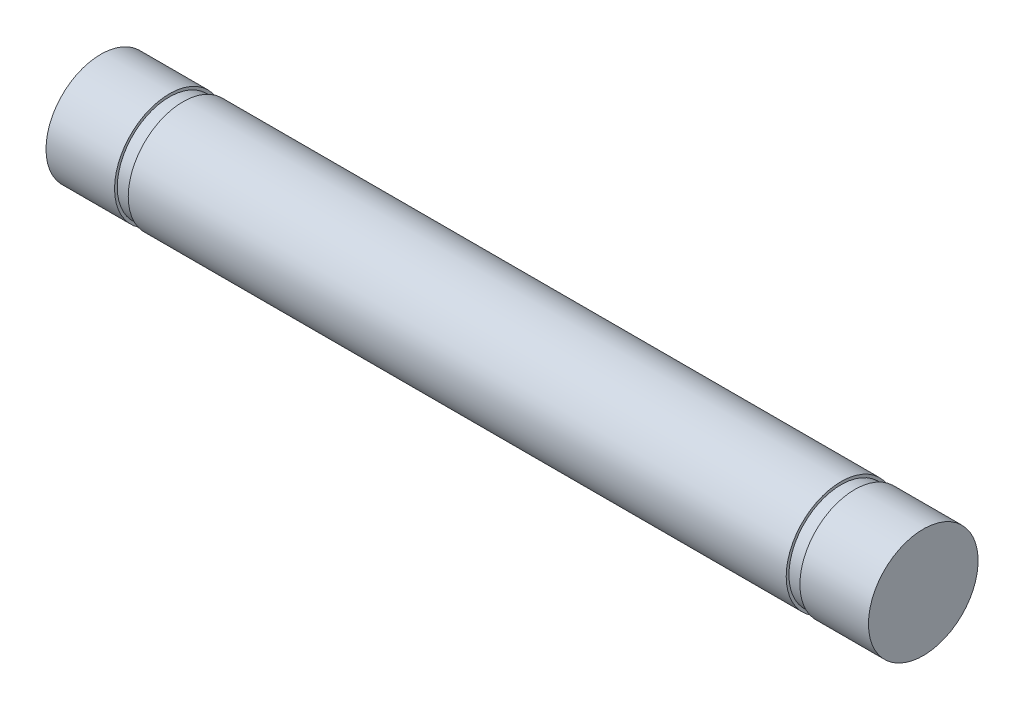
ISO-10303-21;
HEADER;
FILE_DESCRIPTION(('STEP AP214'),'2;1');
FILE_NAME('part.step','',(''),(''),'','','');
FILE_SCHEMA(('AUTOMOTIVE_DESIGN { 1 0 10303 214 1 1 1 1 }'));
ENDSEC;
DATA;
#1=APPLICATION_CONTEXT('core data for automotive mechanical design processes');
#2=APPLICATION_PROTOCOL_DEFINITION('international standard','automotive_design',2000,#1);
#3=PRODUCT_CONTEXT('',#1,'mechanical');
#4=PRODUCT('Part','Part','',(#3));
#5=PRODUCT_RELATED_PRODUCT_CATEGORY('part','',(#4));
#6=PRODUCT_DEFINITION_FORMATION('','',#4);
#7=PRODUCT_DEFINITION_CONTEXT('part definition',#1,'design');
#8=PRODUCT_DEFINITION('design','',#6,#7);
#9=PRODUCT_DEFINITION_SHAPE('','',#8);
#10=(LENGTH_UNIT() NAMED_UNIT(*) SI_UNIT(.MILLI.,.METRE.));
#11=(NAMED_UNIT(*) PLANE_ANGLE_UNIT() SI_UNIT($,.RADIAN.));
#12=(NAMED_UNIT(*) SI_UNIT($,.STERADIAN.) SOLID_ANGLE_UNIT());
#13=UNCERTAINTY_MEASURE_WITH_UNIT(LENGTH_MEASURE(1.E-05),#10,'distance_accuracy_value','');
#14=(GEOMETRIC_REPRESENTATION_CONTEXT(3) GLOBAL_UNCERTAINTY_ASSIGNED_CONTEXT((#13)) GLOBAL_UNIT_ASSIGNED_CONTEXT((#10,
#11,#12)) REPRESENTATION_CONTEXT('',''));
#15=CARTESIAN_POINT('',(0.,0.,0.));
#16=DIRECTION('',(0.,0.,1.));
#17=DIRECTION('',(1.,0.,0.));
#18=AXIS2_PLACEMENT_3D('',#15,#16,#17);
#19=CARTESIAN_POINT('',(0.,0.,0.));
#20=DIRECTION('',(1.,0.,0.));
#21=DIRECTION('',(0.,0.,-1.));
#22=AXIS2_PLACEMENT_3D('',#19,#20,#21);
#23=PLANE('',#22);
#24=CARTESIAN_POINT('',(0.,0.,0.));
#25=DIRECTION('',(-1.,0.,0.));
#26=DIRECTION('',(0.,0.,1.));
#27=AXIS2_PLACEMENT_3D('',#24,#25,#26);
#28=CIRCLE('',#27,2.);
#29=CARTESIAN_POINT('',(0.,0.,2.));
#30=VERTEX_POINT('',#29);
#31=EDGE_CURVE('E10',#30,#30,#28,.T.);
#32=ORIENTED_EDGE('',*,*,#31,.T.);
#33=EDGE_LOOP('',(#32));
#34=FACE_BOUND('',#33,.T.);
#35=ADVANCED_FACE('F33',(#34),#23,.F.);
#36=CARTESIAN_POINT('',(0.,0.,0.));
#37=DIRECTION('',(-1.,0.,0.));
#38=DIRECTION('',(0.,0.,1.));
#39=AXIS2_PLACEMENT_3D('',#36,#37,#38);
#40=CYLINDRICAL_SURFACE('',#39,2.);
#41=ORIENTED_EDGE('',*,*,#31,.F.);
#42=EDGE_LOOP('',(#41));
#43=FACE_BOUND('',#42,.T.);
#44=CARTESIAN_POINT('',(2.5,0.,0.));
#45=DIRECTION('',(-1.,0.,0.));
#46=DIRECTION('',(0.,0.,1.));
#47=AXIS2_PLACEMENT_3D('',#44,#45,#46);
#48=CIRCLE('',#47,2.);
#49=CARTESIAN_POINT('',(2.5,0.,2.));
#50=VERTEX_POINT('',#49);
#51=EDGE_CURVE('E39',#50,#50,#48,.T.);
#52=ORIENTED_EDGE('',*,*,#51,.T.);
#53=EDGE_LOOP('',(#52));
#54=FACE_BOUND('',#53,.T.);
#55=ADVANCED_FACE('F83',(#43,#54),#40,.T.);
#56=CARTESIAN_POINT('',(2.5,1.9,0.));
#57=DIRECTION('',(-1.,0.,0.));
#58=DIRECTION('',(0.,0.,1.));
#59=AXIS2_PLACEMENT_3D('',#56,#57,#58);
#60=PLANE('',#59);
#61=ORIENTED_EDGE('',*,*,#51,.F.);
#62=EDGE_LOOP('',(#61));
#63=FACE_BOUND('',#62,.T.);
#64=CARTESIAN_POINT('',(2.5,0.,0.));
#65=DIRECTION('',(-1.,0.,0.));
#66=DIRECTION('',(0.,0.,1.));
#67=AXIS2_PLACEMENT_3D('',#64,#65,#66);
#68=CIRCLE('',#67,1.9);
#69=CARTESIAN_POINT('',(2.5,0.,1.9));
#70=VERTEX_POINT('',#69);
#71=EDGE_CURVE('E43',#70,#70,#68,.T.);
#72=ORIENTED_EDGE('',*,*,#71,.T.);
#73=EDGE_LOOP('',(#72));
#74=FACE_BOUND('',#73,.T.);
#75=ADVANCED_FACE('F87',(#63,#74),#60,.F.);
#76=CARTESIAN_POINT('',(0.,0.,0.));
#77=DIRECTION('',(-1.,0.,0.));
#78=DIRECTION('',(0.,0.,1.));
#79=AXIS2_PLACEMENT_3D('',#76,#77,#78);
#80=CYLINDRICAL_SURFACE('',#79,1.9);
#81=ORIENTED_EDGE('',*,*,#71,.F.);
#82=EDGE_LOOP('',(#81));
#83=FACE_BOUND('',#82,.T.);
#84=CARTESIAN_POINT('',(3.,0.,0.));
#85=DIRECTION('',(-1.,0.,0.));
#86=DIRECTION('',(0.,0.,1.));
#87=AXIS2_PLACEMENT_3D('',#84,#85,#86);
#88=CIRCLE('',#87,1.9);
#89=CARTESIAN_POINT('',(3.,0.,1.9));
#90=VERTEX_POINT('',#89);
#91=EDGE_CURVE('E47',#90,#90,#88,.T.);
#92=ORIENTED_EDGE('',*,*,#91,.T.);
#93=EDGE_LOOP('',(#92));
#94=FACE_BOUND('',#93,.T.);
#95=ADVANCED_FACE('F92',(#83,#94),#80,.T.);
#96=CARTESIAN_POINT('',(3.,1.9,0.));
#97=DIRECTION('',(1.,0.,0.));
#98=DIRECTION('',(0.,0.,-1.));
#99=AXIS2_PLACEMENT_3D('',#96,#97,#98);
#100=PLANE('',#99);
#101=ORIENTED_EDGE('',*,*,#91,.F.);
#102=EDGE_LOOP('',(#101));
#103=FACE_BOUND('',#102,.T.);
#104=CARTESIAN_POINT('',(3.,0.,0.));
#105=DIRECTION('',(-1.,0.,0.));
#106=DIRECTION('',(0.,0.,1.));
#107=AXIS2_PLACEMENT_3D('',#104,#105,#106);
#108=CIRCLE('',#107,2.);
#109=CARTESIAN_POINT('',(3.,0.,2.));
#110=VERTEX_POINT('',#109);
#111=EDGE_CURVE('E52',#110,#110,#108,.T.);
#112=ORIENTED_EDGE('',*,*,#111,.T.);
#113=EDGE_LOOP('',(#112));
#114=FACE_BOUND('',#113,.T.);
#115=ADVANCED_FACE('F98',(#103,#114),#100,.F.);
#116=CARTESIAN_POINT('',(0.,0.,0.));
#117=DIRECTION('',(-1.,0.,0.));
#118=DIRECTION('',(0.,0.,1.));
#119=AXIS2_PLACEMENT_3D('',#116,#117,#118);
#120=CYLINDRICAL_SURFACE('',#119,2.);
#121=ORIENTED_EDGE('',*,*,#111,.F.);
#122=EDGE_LOOP('',(#121));
#123=FACE_BOUND('',#122,.T.);
#124=CARTESIAN_POINT('',(27.,0.,0.));
#125=DIRECTION('',(-1.,0.,0.));
#126=DIRECTION('',(0.,0.,1.));
#127=AXIS2_PLACEMENT_3D('',#124,#125,#126);
#128=CIRCLE('',#127,2.);
#129=CARTESIAN_POINT('',(27.,0.,2.));
#130=VERTEX_POINT('',#129);
#131=EDGE_CURVE('E55',#130,#130,#128,.T.);
#132=ORIENTED_EDGE('',*,*,#131,.T.);
#133=EDGE_LOOP('',(#132));
#134=FACE_BOUND('',#133,.T.);
#135=ADVANCED_FACE('F102',(#123,#134),#120,.T.);
#136=CARTESIAN_POINT('',(27.,1.9,0.));
#137=DIRECTION('',(-1.,0.,0.));
#138=DIRECTION('',(0.,0.,1.));
#139=AXIS2_PLACEMENT_3D('',#136,#137,#138);
#140=PLANE('',#139);
#141=ORIENTED_EDGE('',*,*,#131,.F.);
#142=EDGE_LOOP('',(#141));
#143=FACE_BOUND('',#142,.T.);
#144=CARTESIAN_POINT('',(27.,0.,0.));
#145=DIRECTION('',(-1.,0.,0.));
#146=DIRECTION('',(0.,0.,1.));
#147=AXIS2_PLACEMENT_3D('',#144,#145,#146);
#148=CIRCLE('',#147,1.9);
#149=CARTESIAN_POINT('',(27.,0.,1.9));
#150=VERTEX_POINT('',#149);
#151=EDGE_CURVE('E58',#150,#150,#148,.T.);
#152=ORIENTED_EDGE('',*,*,#151,.T.);
#153=EDGE_LOOP('',(#152));
#154=FACE_BOUND('',#153,.T.);
#155=ADVANCED_FACE('F106',(#143,#154),#140,.F.);
#156=CARTESIAN_POINT('',(0.,0.,0.));
#157=DIRECTION('',(-1.,0.,0.));
#158=DIRECTION('',(0.,0.,1.));
#159=AXIS2_PLACEMENT_3D('',#156,#157,#158);
#160=CYLINDRICAL_SURFACE('',#159,1.9);
#161=ORIENTED_EDGE('',*,*,#151,.F.);
#162=EDGE_LOOP('',(#161));
#163=FACE_BOUND('',#162,.T.);
#164=CARTESIAN_POINT('',(27.5,0.,0.));
#165=DIRECTION('',(-1.,0.,0.));
#166=DIRECTION('',(0.,0.,1.));
#167=AXIS2_PLACEMENT_3D('',#164,#165,#166);
#168=CIRCLE('',#167,1.9);
#169=CARTESIAN_POINT('',(27.5,0.,1.9));
#170=VERTEX_POINT('',#169);
#171=EDGE_CURVE('E61',#170,#170,#168,.T.);
#172=ORIENTED_EDGE('',*,*,#171,.T.);
#173=EDGE_LOOP('',(#172));
#174=FACE_BOUND('',#173,.T.);
#175=ADVANCED_FACE('F110',(#163,#174),#160,.T.);
#176=CARTESIAN_POINT('',(27.5,1.9,0.));
#177=DIRECTION('',(1.,0.,0.));
#178=DIRECTION('',(0.,0.,-1.));
#179=AXIS2_PLACEMENT_3D('',#176,#177,#178);
#180=PLANE('',#179);
#181=ORIENTED_EDGE('',*,*,#171,.F.);
#182=EDGE_LOOP('',(#181));
#183=FACE_BOUND('',#182,.T.);
#184=CARTESIAN_POINT('',(27.5,0.,0.));
#185=DIRECTION('',(-1.,0.,0.));
#186=DIRECTION('',(0.,0.,1.));
#187=AXIS2_PLACEMENT_3D('',#184,#185,#186);
#188=CIRCLE('',#187,2.);
#189=CARTESIAN_POINT('',(27.5,0.,2.));
#190=VERTEX_POINT('',#189);
#191=EDGE_CURVE('E64',#190,#190,#188,.T.);
#192=ORIENTED_EDGE('',*,*,#191,.T.);
#193=EDGE_LOOP('',(#192));
#194=FACE_BOUND('',#193,.T.);
#195=ADVANCED_FACE('F79',(#183,#194),#180,.F.);
#196=CARTESIAN_POINT('',(0.,0.,0.));
#197=DIRECTION('',(-1.,0.,0.));
#198=DIRECTION('',(0.,0.,1.));
#199=AXIS2_PLACEMENT_3D('',#196,#197,#198);
#200=CYLINDRICAL_SURFACE('',#199,2.);
#201=ORIENTED_EDGE('',*,*,#191,.F.);
#202=EDGE_LOOP('',(#201));
#203=FACE_BOUND('',#202,.T.);
#204=CARTESIAN_POINT('',(30.,0.,0.));
#205=DIRECTION('',(-1.,0.,0.));
#206=DIRECTION('',(0.,0.,1.));
#207=AXIS2_PLACEMENT_3D('',#204,#205,#206);
#208=CIRCLE('',#207,2.);
#209=CARTESIAN_POINT('',(30.,0.,2.));
#210=VERTEX_POINT('',#209);
#211=EDGE_CURVE('E67',#210,#210,#208,.T.);
#212=ORIENTED_EDGE('',*,*,#211,.T.);
#213=EDGE_LOOP('',(#212));
#214=FACE_BOUND('',#213,.T.);
#215=ADVANCED_FACE('F71',(#203,#214),#200,.T.);
#216=CARTESIAN_POINT('',(30.,0.,0.));
#217=DIRECTION('',(-1.,0.,0.));
#218=DIRECTION('',(0.,0.,1.));
#219=AXIS2_PLACEMENT_3D('',#216,#217,#218);
#220=PLANE('',#219);
#221=ORIENTED_EDGE('',*,*,#211,.F.);
#222=EDGE_LOOP('',(#221));
#223=FACE_BOUND('',#222,.T.);
#224=ADVANCED_FACE('F73',(#223),#220,.F.);
#225=CLOSED_SHELL('',(#35,#55,#75,#95,#115,#135,#155,#175,#195,#215,#224));
#226=MANIFOLD_SOLID_BREP('B2',#225);
#227=ADVANCED_BREP_SHAPE_REPRESENTATION('',(#18,#226),#14);
#228=SHAPE_DEFINITION_REPRESENTATION(#9,#227);
ENDSEC;
END-ISO-10303-21;
